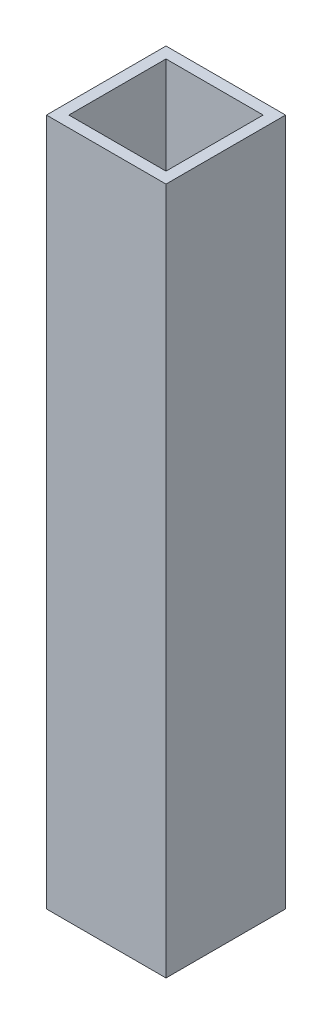
ISO-10303-21;
HEADER;
FILE_DESCRIPTION(('STEP AP214'),'2;1');
FILE_NAME('part.step','',(''),(''),'','','');
FILE_SCHEMA(('AUTOMOTIVE_DESIGN { 1 0 10303 214 1 1 1 1 }'));
ENDSEC;
DATA;
#1=APPLICATION_CONTEXT('core data for automotive mechanical design processes');
#2=APPLICATION_PROTOCOL_DEFINITION('international standard','automotive_design',2000,#1);
#3=PRODUCT_CONTEXT('',#1,'mechanical');
#4=PRODUCT('Part','Part','',(#3));
#5=PRODUCT_RELATED_PRODUCT_CATEGORY('part','',(#4));
#6=PRODUCT_DEFINITION_FORMATION('','',#4);
#7=PRODUCT_DEFINITION_CONTEXT('part definition',#1,'design');
#8=PRODUCT_DEFINITION('design','',#6,#7);
#9=PRODUCT_DEFINITION_SHAPE('','',#8);
#10=(LENGTH_UNIT() NAMED_UNIT(*) SI_UNIT(.MILLI.,.METRE.));
#11=(NAMED_UNIT(*) PLANE_ANGLE_UNIT() SI_UNIT($,.RADIAN.));
#12=(NAMED_UNIT(*) SI_UNIT($,.STERADIAN.) SOLID_ANGLE_UNIT());
#13=UNCERTAINTY_MEASURE_WITH_UNIT(LENGTH_MEASURE(1.E-05),#10,'distance_accuracy_value','');
#14=(GEOMETRIC_REPRESENTATION_CONTEXT(3) GLOBAL_UNCERTAINTY_ASSIGNED_CONTEXT((#13)) GLOBAL_UNIT_ASSIGNED_CONTEXT((#10,
#11,#12)) REPRESENTATION_CONTEXT('',''));
#15=CARTESIAN_POINT('',(0.,0.,0.));
#16=DIRECTION('',(0.,0.,1.));
#17=DIRECTION('',(1.,0.,0.));
#18=AXIS2_PLACEMENT_3D('',#15,#16,#17);
#19=CARTESIAN_POINT('',(25.4,146.05,50.8));
#20=DIRECTION('',(-1.,0.,0.));
#21=DIRECTION('',(0.,-1.,0.));
#22=AXIS2_PLACEMENT_3D('',#19,#20,#21);
#23=PLANE('',#22);
#24=DIRECTION('',(0.,1.,0.));
#25=VECTOR('',#24,1.);
#26=CARTESIAN_POINT('',(25.4,146.05,0.));
#27=LINE('',#26,#25);
#28=CARTESIAN_POINT('',(25.4,-146.05,0.));
#29=VERTEX_POINT('',#28);
#30=CARTESIAN_POINT('',(25.4,146.05,0.));
#31=VERTEX_POINT('',#30);
#32=EDGE_CURVE('E110',#29,#31,#27,.T.);
#33=ORIENTED_EDGE('',*,*,#32,.T.);
#34=DIRECTION('',(0.,0.,-1.));
#35=VECTOR('',#34,1.);
#36=CARTESIAN_POINT('',(25.4,146.05,50.8));
#37=LINE('',#36,#35);
#38=CARTESIAN_POINT('',(25.4,146.05,50.8));
#39=VERTEX_POINT('',#38);
#40=EDGE_CURVE('E11',#39,#31,#37,.T.);
#41=ORIENTED_EDGE('',*,*,#40,.F.);
#42=DIRECTION('',(0.,1.,0.));
#43=VECTOR('',#42,1.);
#44=CARTESIAN_POINT('',(25.4,146.05,50.8));
#45=LINE('',#44,#43);
#46=CARTESIAN_POINT('',(25.4,-146.05,50.8));
#47=VERTEX_POINT('',#46);
#48=EDGE_CURVE('E133',#47,#39,#45,.T.);
#49=ORIENTED_EDGE('',*,*,#48,.F.);
#50=DIRECTION('',(0.,0.,-1.));
#51=VECTOR('',#50,1.);
#52=CARTESIAN_POINT('',(25.4,-146.05,50.8));
#53=LINE('',#52,#51);
#54=EDGE_CURVE('E143',#47,#29,#53,.T.);
#55=ORIENTED_EDGE('',*,*,#54,.T.);
#56=EDGE_LOOP('',(#33,#41,#49,#55));
#57=FACE_BOUND('',#56,.T.);
#58=ADVANCED_FACE('F32',(#57),#23,.F.);
#59=CARTESIAN_POINT('',(-25.4,146.05,50.8));
#60=DIRECTION('',(0.,-1.,0.));
#61=DIRECTION('',(0.,0.,-1.));
#62=AXIS2_PLACEMENT_3D('',#59,#60,#61);
#63=PLANE('',#62);
#64=DIRECTION('',(0.,0.,-1.));
#65=VECTOR('',#64,1.);
#66=CARTESIAN_POINT('',(20.6375,146.05,46.0375));
#67=LINE('',#66,#65);
#68=CARTESIAN_POINT('',(20.6375,146.05,46.0375));
#69=VERTEX_POINT('',#68);
#70=CARTESIAN_POINT('',(20.6375,146.05,4.7625));
#71=VERTEX_POINT('',#70);
#72=EDGE_CURVE('E118',#69,#71,#67,.T.);
#73=ORIENTED_EDGE('',*,*,#72,.F.);
#74=DIRECTION('',(1.,0.,0.));
#75=VECTOR('',#74,1.);
#76=CARTESIAN_POINT('',(-20.6375,146.05,46.0375));
#77=LINE('',#76,#75);
#78=CARTESIAN_POINT('',(-20.6375,146.05,46.0375));
#79=VERTEX_POINT('',#78);
#80=EDGE_CURVE('E46',#79,#69,#77,.T.);
#81=ORIENTED_EDGE('',*,*,#80,.F.);
#82=DIRECTION('',(0.,0.,1.));
#83=VECTOR('',#82,1.);
#84=CARTESIAN_POINT('',(-20.6375,146.05,4.7625));
#85=LINE('',#84,#83);
#86=CARTESIAN_POINT('',(-20.6375,146.05,4.7625));
#87=VERTEX_POINT('',#86);
#88=EDGE_CURVE('E104',#87,#79,#85,.T.);
#89=ORIENTED_EDGE('',*,*,#88,.F.);
#90=DIRECTION('',(-1.,0.,0.));
#91=VECTOR('',#90,1.);
#92=CARTESIAN_POINT('',(20.6375,146.05,4.7625));
#93=LINE('',#92,#91);
#94=EDGE_CURVE('E124',#71,#87,#93,.T.);
#95=ORIENTED_EDGE('',*,*,#94,.F.);
#96=EDGE_LOOP('',(#73,#81,#89,#95));
#97=FACE_BOUND('',#96,.T.);
#98=DIRECTION('',(-1.,0.,0.));
#99=VECTOR('',#98,1.);
#100=CARTESIAN_POINT('',(-25.4,146.05,0.));
#101=LINE('',#100,#99);
#102=CARTESIAN_POINT('',(-25.4,146.05,0.));
#103=VERTEX_POINT('',#102);
#104=EDGE_CURVE('E146',#31,#103,#101,.T.);
#105=ORIENTED_EDGE('',*,*,#104,.T.);
#106=DIRECTION('',(0.,0.,-1.));
#107=VECTOR('',#106,1.);
#108=CARTESIAN_POINT('',(-25.4,146.05,50.8));
#109=LINE('',#108,#107);
#110=CARTESIAN_POINT('',(-25.4,146.05,50.8));
#111=VERTEX_POINT('',#110);
#112=EDGE_CURVE('E39',#111,#103,#109,.T.);
#113=ORIENTED_EDGE('',*,*,#112,.F.);
#114=DIRECTION('',(-1.,0.,0.));
#115=VECTOR('',#114,1.);
#116=CARTESIAN_POINT('',(-25.4,146.05,50.8));
#117=LINE('',#116,#115);
#118=EDGE_CURVE('E136',#39,#111,#117,.T.);
#119=ORIENTED_EDGE('',*,*,#118,.F.);
#120=ORIENTED_EDGE('',*,*,#40,.T.);
#121=EDGE_LOOP('',(#105,#113,#119,#120));
#122=FACE_BOUND('',#121,.T.);
#123=ADVANCED_FACE('F174',(#97,#122),#63,.F.);
#124=CARTESIAN_POINT('',(-25.4,146.05,50.8));
#125=DIRECTION('',(1.,0.,0.));
#126=DIRECTION('',(0.,1.,0.));
#127=AXIS2_PLACEMENT_3D('',#124,#125,#126);
#128=PLANE('',#127);
#129=DIRECTION('',(0.,-1.,0.));
#130=VECTOR('',#129,1.);
#131=CARTESIAN_POINT('',(-25.4,146.05,0.));
#132=LINE('',#131,#130);
#133=CARTESIAN_POINT('',(-25.4,-146.05,0.));
#134=VERTEX_POINT('',#133);
#135=EDGE_CURVE('E148',#103,#134,#132,.T.);
#136=ORIENTED_EDGE('',*,*,#135,.T.);
#137=DIRECTION('',(0.,0.,-1.));
#138=VECTOR('',#137,1.);
#139=CARTESIAN_POINT('',(-25.4,-146.05,50.8));
#140=LINE('',#139,#138);
#141=CARTESIAN_POINT('',(-25.4,-146.05,50.8));
#142=VERTEX_POINT('',#141);
#143=EDGE_CURVE('E153',#142,#134,#140,.T.);
#144=ORIENTED_EDGE('',*,*,#143,.F.);
#145=DIRECTION('',(0.,-1.,0.));
#146=VECTOR('',#145,1.);
#147=CARTESIAN_POINT('',(-25.4,146.05,50.8));
#148=LINE('',#147,#146);
#149=EDGE_CURVE('E139',#111,#142,#148,.T.);
#150=ORIENTED_EDGE('',*,*,#149,.F.);
#151=ORIENTED_EDGE('',*,*,#112,.T.);
#152=EDGE_LOOP('',(#136,#144,#150,#151));
#153=FACE_BOUND('',#152,.T.);
#154=ADVANCED_FACE('F160',(#153),#128,.F.);
#155=CARTESIAN_POINT('',(-25.4,-146.05,50.8));
#156=DIRECTION('',(0.,1.,0.));
#157=DIRECTION('',(0.,0.,1.));
#158=AXIS2_PLACEMENT_3D('',#155,#156,#157);
#159=PLANE('',#158);
#160=DIRECTION('',(0.,0.,-1.));
#161=VECTOR('',#160,1.);
#162=CARTESIAN_POINT('',(-20.6375,-146.05,4.7625));
#163=LINE('',#162,#161);
#164=CARTESIAN_POINT('',(-20.6375,-146.05,46.0375));
#165=VERTEX_POINT('',#164);
#166=CARTESIAN_POINT('',(-20.6375,-146.05,4.7625));
#167=VERTEX_POINT('',#166);
#168=EDGE_CURVE('E116',#165,#167,#163,.T.);
#169=ORIENTED_EDGE('',*,*,#168,.F.);
#170=DIRECTION('',(-1.,0.,0.));
#171=VECTOR('',#170,1.);
#172=CARTESIAN_POINT('',(-20.6375,-146.05,46.0375));
#173=LINE('',#172,#171);
#174=CARTESIAN_POINT('',(20.6375,-146.05,46.0375));
#175=VERTEX_POINT('',#174);
#176=EDGE_CURVE('E98',#175,#165,#173,.T.);
#177=ORIENTED_EDGE('',*,*,#176,.F.);
#178=DIRECTION('',(0.,0.,1.));
#179=VECTOR('',#178,1.);
#180=CARTESIAN_POINT('',(20.6375,-146.05,46.0375));
#181=LINE('',#180,#179);
#182=CARTESIAN_POINT('',(20.6375,-146.05,4.7625));
#183=VERTEX_POINT('',#182);
#184=EDGE_CURVE('E107',#183,#175,#181,.T.);
#185=ORIENTED_EDGE('',*,*,#184,.F.);
#186=DIRECTION('',(1.,0.,0.));
#187=VECTOR('',#186,1.);
#188=CARTESIAN_POINT('',(20.6375,-146.05,4.7625));
#189=LINE('',#188,#187);
#190=EDGE_CURVE('E54',#167,#183,#189,.T.);
#191=ORIENTED_EDGE('',*,*,#190,.F.);
#192=EDGE_LOOP('',(#169,#177,#185,#191));
#193=FACE_BOUND('',#192,.T.);
#194=DIRECTION('',(1.,0.,0.));
#195=VECTOR('',#194,1.);
#196=CARTESIAN_POINT('',(-25.4,-146.05,0.));
#197=LINE('',#196,#195);
#198=EDGE_CURVE('E137',#134,#29,#197,.T.);
#199=ORIENTED_EDGE('',*,*,#198,.T.);
#200=ORIENTED_EDGE('',*,*,#54,.F.);
#201=DIRECTION('',(1.,0.,0.));
#202=VECTOR('',#201,1.);
#203=CARTESIAN_POINT('',(-25.4,-146.05,50.8));
#204=LINE('',#203,#202);
#205=EDGE_CURVE('E141',#142,#47,#204,.T.);
#206=ORIENTED_EDGE('',*,*,#205,.F.);
#207=ORIENTED_EDGE('',*,*,#143,.T.);
#208=EDGE_LOOP('',(#199,#200,#206,#207));
#209=FACE_BOUND('',#208,.T.);
#210=ADVANCED_FACE('F113',(#193,#209),#159,.F.);
#211=CARTESIAN_POINT('',(25.4,-146.05,50.8));
#212=DIRECTION('',(0.,0.,1.));
#213=DIRECTION('',(1.,0.,0.));
#214=AXIS2_PLACEMENT_3D('',#211,#212,#213);
#215=PLANE('',#214);
#216=ORIENTED_EDGE('',*,*,#48,.T.);
#217=ORIENTED_EDGE('',*,*,#118,.T.);
#218=ORIENTED_EDGE('',*,*,#149,.T.);
#219=ORIENTED_EDGE('',*,*,#205,.T.);
#220=EDGE_LOOP('',(#216,#217,#218,#219));
#221=FACE_BOUND('',#220,.T.);
#222=ADVANCED_FACE('F173',(#221),#215,.T.);
#223=CARTESIAN_POINT('',(25.4,-146.05,0.));
#224=DIRECTION('',(0.,0.,1.));
#225=DIRECTION('',(1.,0.,0.));
#226=AXIS2_PLACEMENT_3D('',#223,#224,#225);
#227=PLANE('',#226);
#228=ORIENTED_EDGE('',*,*,#32,.F.);
#229=ORIENTED_EDGE('',*,*,#198,.F.);
#230=ORIENTED_EDGE('',*,*,#135,.F.);
#231=ORIENTED_EDGE('',*,*,#104,.F.);
#232=EDGE_LOOP('',(#228,#229,#230,#231));
#233=FACE_BOUND('',#232,.T.);
#234=ADVANCED_FACE('F166',(#233),#227,.F.);
#235=CARTESIAN_POINT('',(-20.6375,-146.051,46.0375));
#236=DIRECTION('',(0.,0.,1.));
#237=DIRECTION('',(1.,0.,0.));
#238=AXIS2_PLACEMENT_3D('',#235,#236,#237);
#239=PLANE('',#238);
#240=ORIENTED_EDGE('',*,*,#176,.T.);
#241=DIRECTION('',(0.,1.,0.));
#242=VECTOR('',#241,1.);
#243=CARTESIAN_POINT('',(-20.6375,-146.051,46.0375));
#244=LINE('',#243,#242);
#245=EDGE_CURVE('E111',#165,#79,#244,.T.);
#246=ORIENTED_EDGE('',*,*,#245,.T.);
#247=ORIENTED_EDGE('',*,*,#80,.T.);
#248=DIRECTION('',(0.,1.,0.));
#249=VECTOR('',#248,1.);
#250=CARTESIAN_POINT('',(20.6375,-146.051,46.0375));
#251=LINE('',#250,#249);
#252=EDGE_CURVE('E94',#175,#69,#251,.T.);
#253=ORIENTED_EDGE('',*,*,#252,.F.);
#254=EDGE_LOOP('',(#240,#246,#247,#253));
#255=FACE_BOUND('',#254,.T.);
#256=ADVANCED_FACE('F96',(#255),#239,.F.);
#257=CARTESIAN_POINT('',(-20.6375,-146.051,4.7625));
#258=DIRECTION('',(-1.,0.,0.));
#259=DIRECTION('',(0.,0.,1.));
#260=AXIS2_PLACEMENT_3D('',#257,#258,#259);
#261=PLANE('',#260);
#262=ORIENTED_EDGE('',*,*,#168,.T.);
#263=DIRECTION('',(0.,1.,0.));
#264=VECTOR('',#263,1.);
#265=CARTESIAN_POINT('',(-20.6375,-146.051,4.7625));
#266=LINE('',#265,#264);
#267=EDGE_CURVE('E130',#167,#87,#266,.T.);
#268=ORIENTED_EDGE('',*,*,#267,.T.);
#269=ORIENTED_EDGE('',*,*,#88,.T.);
#270=ORIENTED_EDGE('',*,*,#245,.F.);
#271=EDGE_LOOP('',(#262,#268,#269,#270));
#272=FACE_BOUND('',#271,.T.);
#273=ADVANCED_FACE('F191',(#272),#261,.F.);
#274=CARTESIAN_POINT('',(20.6375,-146.051,4.7625));
#275=DIRECTION('',(0.,0.,-1.));
#276=DIRECTION('',(-1.,0.,0.));
#277=AXIS2_PLACEMENT_3D('',#274,#275,#276);
#278=PLANE('',#277);
#279=ORIENTED_EDGE('',*,*,#190,.T.);
#280=DIRECTION('',(0.,1.,0.));
#281=VECTOR('',#280,1.);
#282=CARTESIAN_POINT('',(20.6375,-146.051,4.7625));
#283=LINE('',#282,#281);
#284=EDGE_CURVE('E103',#183,#71,#283,.T.);
#285=ORIENTED_EDGE('',*,*,#284,.T.);
#286=ORIENTED_EDGE('',*,*,#94,.T.);
#287=ORIENTED_EDGE('',*,*,#267,.F.);
#288=EDGE_LOOP('',(#279,#285,#286,#287));
#289=FACE_BOUND('',#288,.T.);
#290=ADVANCED_FACE('F194',(#289),#278,.F.);
#291=CARTESIAN_POINT('',(20.6375,-146.051,46.0375));
#292=DIRECTION('',(1.,0.,0.));
#293=DIRECTION('',(0.,0.,-1.));
#294=AXIS2_PLACEMENT_3D('',#291,#292,#293);
#295=PLANE('',#294);
#296=ORIENTED_EDGE('',*,*,#184,.T.);
#297=ORIENTED_EDGE('',*,*,#252,.T.);
#298=ORIENTED_EDGE('',*,*,#72,.T.);
#299=ORIENTED_EDGE('',*,*,#284,.F.);
#300=EDGE_LOOP('',(#296,#297,#298,#299));
#301=FACE_BOUND('',#300,.T.);
#302=ADVANCED_FACE('F108',(#301),#295,.F.);
#303=CLOSED_SHELL('',(#58,#123,#154,#210,#222,#234,#256,#273,#290,#302));
#304=MANIFOLD_SOLID_BREP('B2',#303);
#305=ADVANCED_BREP_SHAPE_REPRESENTATION('',(#18,#304),#14);
#306=SHAPE_DEFINITION_REPRESENTATION(#9,#305);
ENDSEC;
END-ISO-10303-21;
